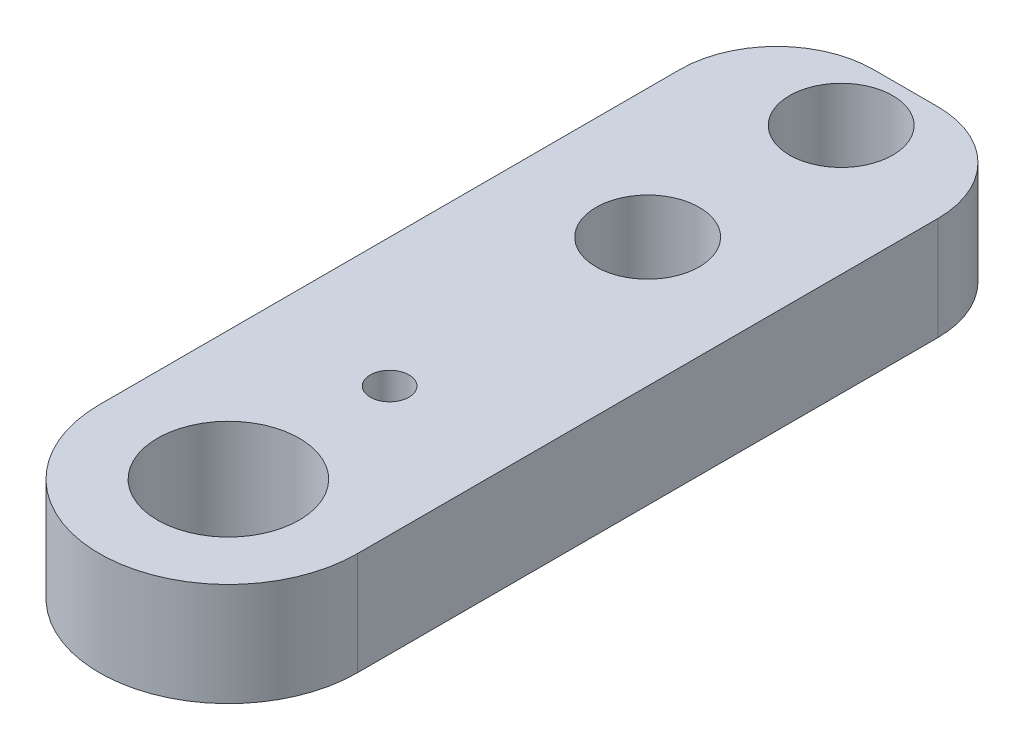
ISO-10303-21;
HEADER;
FILE_DESCRIPTION(('STEP AP214'),'2;1');
FILE_NAME('part.step','',(''),(''),'','','');
FILE_SCHEMA(('AUTOMOTIVE_DESIGN { 1 0 10303 214 1 1 1 1 }'));
ENDSEC;
DATA;
#1=APPLICATION_CONTEXT('core data for automotive mechanical design processes');
#2=APPLICATION_PROTOCOL_DEFINITION('international standard','automotive_design',2000,#1);
#3=PRODUCT_CONTEXT('',#1,'mechanical');
#4=PRODUCT('Part','Part','',(#3));
#5=PRODUCT_RELATED_PRODUCT_CATEGORY('part','',(#4));
#6=PRODUCT_DEFINITION_FORMATION('','',#4);
#7=PRODUCT_DEFINITION_CONTEXT('part definition',#1,'design');
#8=PRODUCT_DEFINITION('design','',#6,#7);
#9=PRODUCT_DEFINITION_SHAPE('','',#8);
#10=(LENGTH_UNIT() NAMED_UNIT(*) SI_UNIT(.MILLI.,.METRE.));
#11=(NAMED_UNIT(*) PLANE_ANGLE_UNIT() SI_UNIT($,.RADIAN.));
#12=(NAMED_UNIT(*) SI_UNIT($,.STERADIAN.) SOLID_ANGLE_UNIT());
#13=UNCERTAINTY_MEASURE_WITH_UNIT(LENGTH_MEASURE(1.E-05),#10,'distance_accuracy_value','');
#14=(GEOMETRIC_REPRESENTATION_CONTEXT(3) GLOBAL_UNCERTAINTY_ASSIGNED_CONTEXT((#13)) GLOBAL_UNIT_ASSIGNED_CONTEXT((#10,
#11,#12)) REPRESENTATION_CONTEXT('',''));
#15=CARTESIAN_POINT('',(0.,0.,0.));
#16=DIRECTION('',(0.,0.,1.));
#17=DIRECTION('',(1.,0.,0.));
#18=AXIS2_PLACEMENT_3D('',#15,#16,#17);
#19=CARTESIAN_POINT('',(1.,3.2,-8.91390148289637));
#20=DIRECTION('',(0.,-1.,0.));
#21=DIRECTION('',(0.,0.,-1.));
#22=AXIS2_PLACEMENT_3D('',#19,#20,#21);
#23=PLANE('',#22);
#24=CARTESIAN_POINT('',(1.,3.2,-8.91390148289637));
#25=DIRECTION('',(0.,1.,0.));
#26=DIRECTION('',(0.,0.,-1.));
#27=AXIS2_PLACEMENT_3D('',#24,#25,#26);
#28=CIRCLE('',#27,3.);
#29=CARTESIAN_POINT('',(4.,3.2,-8.91390148289635));
#30=VERTEX_POINT('',#29);
#31=CARTESIAN_POINT('',(0.999999999999979,3.2,-11.9139014828964));
#32=VERTEX_POINT('',#31);
#33=EDGE_CURVE('E146',#30,#32,#28,.T.);
#34=ORIENTED_EDGE('',*,*,#33,.T.);
#35=DIRECTION('',(-1.,0.,0.));
#36=VECTOR('',#35,1.);
#37=CARTESIAN_POINT('',(-0.999999999999979,3.2,-11.9139014828964));
#38=LINE('',#37,#36);
#39=CARTESIAN_POINT('',(-0.999999999999979,3.2,-11.9139014828964));
#40=VERTEX_POINT('',#39);
#41=EDGE_CURVE('E94',#32,#40,#38,.T.);
#42=ORIENTED_EDGE('',*,*,#41,.T.);
#43=CARTESIAN_POINT('',(-1.,3.2,-8.91390148289637));
#44=DIRECTION('',(0.,1.,0.));
#45=DIRECTION('',(0.,0.,-1.));
#46=AXIS2_PLACEMENT_3D('',#43,#44,#45);
#47=CIRCLE('',#46,3.);
#48=CARTESIAN_POINT('',(-4.,3.2,-8.91390148289634));
#49=VERTEX_POINT('',#48);
#50=EDGE_CURVE('E107',#40,#49,#47,.T.);
#51=ORIENTED_EDGE('',*,*,#50,.T.);
#52=DIRECTION('',(0.,0.,1.));
#53=VECTOR('',#52,1.);
#54=CARTESIAN_POINT('',(-4.,3.2,9.08609851710363));
#55=LINE('',#54,#53);
#56=CARTESIAN_POINT('',(-4.,3.2,9.08609851710363));
#57=VERTEX_POINT('',#56);
#58=EDGE_CURVE('E101',#49,#57,#55,.T.);
#59=ORIENTED_EDGE('',*,*,#58,.T.);
#60=CARTESIAN_POINT('',(0.,3.2,9.08609851710363));
#61=DIRECTION('',(0.,1.,0.));
#62=DIRECTION('',(0.,0.,1.));
#63=AXIS2_PLACEMENT_3D('',#60,#61,#62);
#64=CIRCLE('',#63,4.);
#65=CARTESIAN_POINT('',(4.,3.2,9.08609851710363));
#66=VERTEX_POINT('',#65);
#67=EDGE_CURVE('E105',#57,#66,#64,.T.);
#68=ORIENTED_EDGE('',*,*,#67,.T.);
#69=DIRECTION('',(0.,0.,-1.));
#70=VECTOR('',#69,1.);
#71=CARTESIAN_POINT('',(4.,3.2,-8.91390148289635));
#72=LINE('',#71,#70);
#73=EDGE_CURVE('E57',#66,#30,#72,.T.);
#74=ORIENTED_EDGE('',*,*,#73,.T.);
#75=EDGE_LOOP('',(#34,#42,#51,#59,#68,#74));
#76=FACE_BOUND('',#75,.T.);
#77=CARTESIAN_POINT('',(0.,3.2,-9.91390148289637));
#78=DIRECTION('',(0.,1.,0.));
#79=DIRECTION('',(0.,0.,1.));
#80=AXIS2_PLACEMENT_3D('',#77,#78,#79);
#81=CIRCLE('',#80,1.6);
#82=CARTESIAN_POINT('',(0.,3.2,-8.31390148289637));
#83=VERTEX_POINT('',#82);
#84=EDGE_CURVE('E134',#83,#83,#81,.T.);
#85=ORIENTED_EDGE('',*,*,#84,.F.);
#86=EDGE_LOOP('',(#85));
#87=FACE_BOUND('',#86,.T.);
#88=CARTESIAN_POINT('',(0.,3.2,9.08609851710363));
#89=DIRECTION('',(0.,1.,0.));
#90=DIRECTION('',(0.,0.,1.));
#91=AXIS2_PLACEMENT_3D('',#88,#89,#90);
#92=CIRCLE('',#91,2.2);
#93=CARTESIAN_POINT('',(0.,3.2,11.2860985171036));
#94=VERTEX_POINT('',#93);
#95=EDGE_CURVE('E218',#94,#94,#92,.T.);
#96=ORIENTED_EDGE('',*,*,#95,.F.);
#97=EDGE_LOOP('',(#96));
#98=FACE_BOUND('',#97,.T.);
#99=CARTESIAN_POINT('',(0.,3.2,-3.91390148289637));
#100=DIRECTION('',(0.,1.,0.));
#101=DIRECTION('',(0.,0.,1.));
#102=AXIS2_PLACEMENT_3D('',#99,#100,#101);
#103=CIRCLE('',#102,1.6);
#104=CARTESIAN_POINT('',(0.,3.2,-2.31390148289637));
#105=VERTEX_POINT('',#104);
#106=EDGE_CURVE('E210',#105,#105,#103,.T.);
#107=ORIENTED_EDGE('',*,*,#106,.F.);
#108=EDGE_LOOP('',(#107));
#109=FACE_BOUND('',#108,.T.);
#110=CARTESIAN_POINT('',(0.,3.2,4.08609851710364));
#111=DIRECTION('',(0.,1.,0.));
#112=DIRECTION('',(0.,0.,1.));
#113=AXIS2_PLACEMENT_3D('',#110,#111,#112);
#114=CIRCLE('',#113,0.6);
#115=CARTESIAN_POINT('',(0.,3.2,4.68609851710363));
#116=VERTEX_POINT('',#115);
#117=EDGE_CURVE('E199',#116,#116,#114,.T.);
#118=ORIENTED_EDGE('',*,*,#117,.F.);
#119=EDGE_LOOP('',(#118));
#120=FACE_BOUND('',#119,.T.);
#121=ADVANCED_FACE('F39',(#76,#87,#98,#109,#120),#23,.F.);
#122=CARTESIAN_POINT('',(1.,0.,-8.91390148289637));
#123=DIRECTION('',(0.,-1.,0.));
#124=DIRECTION('',(0.,0.,-1.));
#125=AXIS2_PLACEMENT_3D('',#122,#123,#124);
#126=PLANE('',#125);
#127=CARTESIAN_POINT('',(0.,0.,-3.91390148289637));
#128=DIRECTION('',(0.,1.,0.));
#129=DIRECTION('',(0.,0.,1.));
#130=AXIS2_PLACEMENT_3D('',#127,#128,#129);
#131=CIRCLE('',#130,1.6);
#132=CARTESIAN_POINT('',(0.,0.,-2.31390148289637));
#133=VERTEX_POINT('',#132);
#134=EDGE_CURVE('E207',#133,#133,#131,.T.);
#135=ORIENTED_EDGE('',*,*,#134,.T.);
#136=EDGE_LOOP('',(#135));
#137=FACE_BOUND('',#136,.T.);
#138=CARTESIAN_POINT('',(0.,0.,-9.91390148289637));
#139=DIRECTION('',(0.,1.,0.));
#140=DIRECTION('',(0.,0.,1.));
#141=AXIS2_PLACEMENT_3D('',#138,#139,#140);
#142=CIRCLE('',#141,1.6);
#143=CARTESIAN_POINT('',(0.,0.,-8.31390148289637));
#144=VERTEX_POINT('',#143);
#145=EDGE_CURVE('E222',#144,#144,#142,.T.);
#146=ORIENTED_EDGE('',*,*,#145,.T.);
#147=EDGE_LOOP('',(#146));
#148=FACE_BOUND('',#147,.T.);
#149=CARTESIAN_POINT('',(1.,0.,-8.91390148289637));
#150=DIRECTION('',(0.,1.,0.));
#151=DIRECTION('',(0.,0.,-1.));
#152=AXIS2_PLACEMENT_3D('',#149,#150,#151);
#153=CIRCLE('',#152,3.);
#154=CARTESIAN_POINT('',(4.,0.,-8.91390148289635));
#155=VERTEX_POINT('',#154);
#156=CARTESIAN_POINT('',(0.999999999999979,0.,-11.9139014828964));
#157=VERTEX_POINT('',#156);
#158=EDGE_CURVE('E129',#155,#157,#153,.T.);
#159=ORIENTED_EDGE('',*,*,#158,.F.);
#160=DIRECTION('',(0.,0.,-1.));
#161=VECTOR('',#160,1.);
#162=CARTESIAN_POINT('',(4.,0.,-8.91390148289635));
#163=LINE('',#162,#161);
#164=CARTESIAN_POINT('',(4.,0.,9.08609851710363));
#165=VERTEX_POINT('',#164);
#166=EDGE_CURVE('E86',#165,#155,#163,.T.);
#167=ORIENTED_EDGE('',*,*,#166,.F.);
#168=CARTESIAN_POINT('',(0.,0.,9.08609851710363));
#169=DIRECTION('',(0.,1.,0.));
#170=DIRECTION('',(0.,0.,1.));
#171=AXIS2_PLACEMENT_3D('',#168,#169,#170);
#172=CIRCLE('',#171,4.);
#173=CARTESIAN_POINT('',(-4.,0.,9.08609851710363));
#174=VERTEX_POINT('',#173);
#175=EDGE_CURVE('E80',#174,#165,#172,.T.);
#176=ORIENTED_EDGE('',*,*,#175,.F.);
#177=DIRECTION('',(0.,0.,1.));
#178=VECTOR('',#177,1.);
#179=CARTESIAN_POINT('',(-4.,0.,9.08609851710363));
#180=LINE('',#179,#178);
#181=CARTESIAN_POINT('',(-4.,0.,-8.91390148289634));
#182=VERTEX_POINT('',#181);
#183=EDGE_CURVE('E116',#182,#174,#180,.T.);
#184=ORIENTED_EDGE('',*,*,#183,.F.);
#185=CARTESIAN_POINT('',(-1.,0.,-8.91390148289637));
#186=DIRECTION('',(0.,1.,0.));
#187=DIRECTION('',(0.,0.,-1.));
#188=AXIS2_PLACEMENT_3D('',#185,#186,#187);
#189=CIRCLE('',#188,3.);
#190=CARTESIAN_POINT('',(-0.999999999999979,0.,-11.9139014828964));
#191=VERTEX_POINT('',#190);
#192=EDGE_CURVE('E137',#191,#182,#189,.T.);
#193=ORIENTED_EDGE('',*,*,#192,.F.);
#194=DIRECTION('',(-1.,0.,0.));
#195=VECTOR('',#194,1.);
#196=CARTESIAN_POINT('',(-0.999999999999979,0.,-11.9139014828964));
#197=LINE('',#196,#195);
#198=EDGE_CURVE('E133',#157,#191,#197,.T.);
#199=ORIENTED_EDGE('',*,*,#198,.F.);
#200=EDGE_LOOP('',(#159,#167,#176,#184,#193,#199));
#201=FACE_BOUND('',#200,.T.);
#202=CARTESIAN_POINT('',(0.,0.,9.08609851710363));
#203=DIRECTION('',(0.,1.,0.));
#204=DIRECTION('',(0.,0.,1.));
#205=AXIS2_PLACEMENT_3D('',#202,#203,#204);
#206=CIRCLE('',#205,2.2);
#207=CARTESIAN_POINT('',(0.,0.,11.2860985171036));
#208=VERTEX_POINT('',#207);
#209=EDGE_CURVE('E214',#208,#208,#206,.T.);
#210=ORIENTED_EDGE('',*,*,#209,.T.);
#211=EDGE_LOOP('',(#210));
#212=FACE_BOUND('',#211,.T.);
#213=CARTESIAN_POINT('',(0.,0.,4.08609851710364));
#214=DIRECTION('',(0.,1.,0.));
#215=DIRECTION('',(0.,0.,1.));
#216=AXIS2_PLACEMENT_3D('',#213,#214,#215);
#217=CIRCLE('',#216,0.6);
#218=CARTESIAN_POINT('',(0.,0.,4.68609851710363));
#219=VERTEX_POINT('',#218);
#220=EDGE_CURVE('E202',#219,#219,#217,.T.);
#221=ORIENTED_EDGE('',*,*,#220,.T.);
#222=EDGE_LOOP('',(#221));
#223=FACE_BOUND('',#222,.T.);
#224=ADVANCED_FACE('F159',(#137,#148,#201,#212,#223),#126,.T.);
#225=CARTESIAN_POINT('',(1.,3.2,-8.91390148289637));
#226=DIRECTION('',(0.,-1.,0.));
#227=DIRECTION('',(0.,0.,-1.));
#228=AXIS2_PLACEMENT_3D('',#225,#226,#227);
#229=CYLINDRICAL_SURFACE('',#228,3.);
#230=ORIENTED_EDGE('',*,*,#158,.T.);
#231=DIRECTION('',(0.,-1.,0.));
#232=VECTOR('',#231,1.);
#233=CARTESIAN_POINT('',(0.999999999999979,3.2,-11.9139014828964));
#234=LINE('',#233,#232);
#235=EDGE_CURVE('E11',#32,#157,#234,.T.);
#236=ORIENTED_EDGE('',*,*,#235,.F.);
#237=ORIENTED_EDGE('',*,*,#33,.F.);
#238=DIRECTION('',(0.,-1.,0.));
#239=VECTOR('',#238,1.);
#240=CARTESIAN_POINT('',(4.,3.2,-8.91390148289635));
#241=LINE('',#240,#239);
#242=EDGE_CURVE('E125',#30,#155,#241,.T.);
#243=ORIENTED_EDGE('',*,*,#242,.T.);
#244=EDGE_LOOP('',(#230,#236,#237,#243));
#245=FACE_BOUND('',#244,.T.);
#246=ADVANCED_FACE('F41',(#245),#229,.T.);
#247=CARTESIAN_POINT('',(-0.999999999999979,3.2,-11.9139014828964));
#248=DIRECTION('',(0.,0.,1.));
#249=DIRECTION('',(1.,0.,0.));
#250=AXIS2_PLACEMENT_3D('',#247,#248,#249);
#251=PLANE('',#250);
#252=ORIENTED_EDGE('',*,*,#198,.T.);
#253=DIRECTION('',(0.,-1.,0.));
#254=VECTOR('',#253,1.);
#255=CARTESIAN_POINT('',(-0.999999999999979,3.2,-11.9139014828964));
#256=LINE('',#255,#254);
#257=EDGE_CURVE('E49',#40,#191,#256,.T.);
#258=ORIENTED_EDGE('',*,*,#257,.F.);
#259=ORIENTED_EDGE('',*,*,#41,.F.);
#260=ORIENTED_EDGE('',*,*,#235,.T.);
#261=EDGE_LOOP('',(#252,#258,#259,#260));
#262=FACE_BOUND('',#261,.T.);
#263=ADVANCED_FACE('F288',(#262),#251,.F.);
#264=CARTESIAN_POINT('',(-1.,3.2,-8.91390148289637));
#265=DIRECTION('',(0.,-1.,0.));
#266=DIRECTION('',(0.,0.,-1.));
#267=AXIS2_PLACEMENT_3D('',#264,#265,#266);
#268=CYLINDRICAL_SURFACE('',#267,3.);
#269=ORIENTED_EDGE('',*,*,#192,.T.);
#270=DIRECTION('',(0.,-1.,0.));
#271=VECTOR('',#270,1.);
#272=CARTESIAN_POINT('',(-4.,3.2,-8.91390148289634));
#273=LINE('',#272,#271);
#274=EDGE_CURVE('E118',#49,#182,#273,.T.);
#275=ORIENTED_EDGE('',*,*,#274,.F.);
#276=ORIENTED_EDGE('',*,*,#50,.F.);
#277=ORIENTED_EDGE('',*,*,#257,.T.);
#278=EDGE_LOOP('',(#269,#275,#276,#277));
#279=FACE_BOUND('',#278,.T.);
#280=ADVANCED_FACE('F156',(#279),#268,.T.);
#281=CARTESIAN_POINT('',(-4.,3.2,9.08609851710363));
#282=DIRECTION('',(1.,0.,0.));
#283=DIRECTION('',(0.,0.,-1.));
#284=AXIS2_PLACEMENT_3D('',#281,#282,#283);
#285=PLANE('',#284);
#286=ORIENTED_EDGE('',*,*,#183,.T.);
#287=DIRECTION('',(0.,-1.,0.));
#288=VECTOR('',#287,1.);
#289=CARTESIAN_POINT('',(-4.,3.2,9.08609851710363));
#290=LINE('',#289,#288);
#291=EDGE_CURVE('E113',#57,#174,#290,.T.);
#292=ORIENTED_EDGE('',*,*,#291,.F.);
#293=ORIENTED_EDGE('',*,*,#58,.F.);
#294=ORIENTED_EDGE('',*,*,#274,.T.);
#295=EDGE_LOOP('',(#286,#292,#293,#294));
#296=FACE_BOUND('',#295,.T.);
#297=ADVANCED_FACE('F114',(#296),#285,.F.);
#298=CARTESIAN_POINT('',(0.,3.2,9.08609851710363));
#299=DIRECTION('',(0.,-1.,0.));
#300=DIRECTION('',(0.,0.,-1.));
#301=AXIS2_PLACEMENT_3D('',#298,#299,#300);
#302=CYLINDRICAL_SURFACE('',#301,4.);
#303=ORIENTED_EDGE('',*,*,#175,.T.);
#304=DIRECTION('',(0.,-1.,0.));
#305=VECTOR('',#304,1.);
#306=CARTESIAN_POINT('',(4.,3.2,9.08609851710363));
#307=LINE('',#306,#305);
#308=EDGE_CURVE('E119',#66,#165,#307,.T.);
#309=ORIENTED_EDGE('',*,*,#308,.F.);
#310=ORIENTED_EDGE('',*,*,#67,.F.);
#311=ORIENTED_EDGE('',*,*,#291,.T.);
#312=EDGE_LOOP('',(#303,#309,#310,#311));
#313=FACE_BOUND('',#312,.T.);
#314=ADVANCED_FACE('F121',(#313),#302,.T.);
#315=CARTESIAN_POINT('',(4.,3.2,-8.91390148289635));
#316=DIRECTION('',(-1.,0.,0.));
#317=DIRECTION('',(0.,0.,1.));
#318=AXIS2_PLACEMENT_3D('',#315,#316,#317);
#319=PLANE('',#318);
#320=ORIENTED_EDGE('',*,*,#166,.T.);
#321=ORIENTED_EDGE('',*,*,#242,.F.);
#322=ORIENTED_EDGE('',*,*,#73,.F.);
#323=ORIENTED_EDGE('',*,*,#308,.T.);
#324=EDGE_LOOP('',(#320,#321,#322,#323));
#325=FACE_BOUND('',#324,.T.);
#326=ADVANCED_FACE('F164',(#325),#319,.F.);
#327=CARTESIAN_POINT('',(0.,3.2,-9.91390148289637));
#328=DIRECTION('',(0.,-1.,0.));
#329=DIRECTION('',(0.,0.,-1.));
#330=AXIS2_PLACEMENT_3D('',#327,#328,#329);
#331=CYLINDRICAL_SURFACE('',#330,1.6);
#332=ORIENTED_EDGE('',*,*,#84,.T.);
#333=EDGE_LOOP('',(#332));
#334=FACE_BOUND('',#333,.T.);
#335=ORIENTED_EDGE('',*,*,#145,.F.);
#336=EDGE_LOOP('',(#335));
#337=FACE_BOUND('',#336,.T.);
#338=ADVANCED_FACE('F166',(#334,#337),#331,.F.);
#339=CARTESIAN_POINT('',(0.,3.2,9.08609851710363));
#340=DIRECTION('',(0.,-1.,0.));
#341=DIRECTION('',(0.,0.,-1.));
#342=AXIS2_PLACEMENT_3D('',#339,#340,#341);
#343=CYLINDRICAL_SURFACE('',#342,2.2);
#344=ORIENTED_EDGE('',*,*,#95,.T.);
#345=EDGE_LOOP('',(#344));
#346=FACE_BOUND('',#345,.T.);
#347=ORIENTED_EDGE('',*,*,#209,.F.);
#348=EDGE_LOOP('',(#347));
#349=FACE_BOUND('',#348,.T.);
#350=ADVANCED_FACE('F172',(#346,#349),#343,.F.);
#351=CARTESIAN_POINT('',(0.,3.2,-3.91390148289637));
#352=DIRECTION('',(0.,-1.,0.));
#353=DIRECTION('',(0.,0.,-1.));
#354=AXIS2_PLACEMENT_3D('',#351,#352,#353);
#355=CYLINDRICAL_SURFACE('',#354,1.6);
#356=ORIENTED_EDGE('',*,*,#106,.T.);
#357=EDGE_LOOP('',(#356));
#358=FACE_BOUND('',#357,.T.);
#359=ORIENTED_EDGE('',*,*,#134,.F.);
#360=EDGE_LOOP('',(#359));
#361=FACE_BOUND('',#360,.T.);
#362=ADVANCED_FACE('F186',(#358,#361),#355,.F.);
#363=CARTESIAN_POINT('',(0.,3.2,4.08609851710364));
#364=DIRECTION('',(0.,-1.,0.));
#365=DIRECTION('',(0.,0.,-1.));
#366=AXIS2_PLACEMENT_3D('',#363,#364,#365);
#367=CYLINDRICAL_SURFACE('',#366,0.6);
#368=ORIENTED_EDGE('',*,*,#117,.T.);
#369=EDGE_LOOP('',(#368));
#370=FACE_BOUND('',#369,.T.);
#371=ORIENTED_EDGE('',*,*,#220,.F.);
#372=EDGE_LOOP('',(#371));
#373=FACE_BOUND('',#372,.T.);
#374=ADVANCED_FACE('F190',(#370,#373),#367,.F.);
#375=CLOSED_SHELL('',(#121,#224,#246,#263,#280,#297,#314,#326,#338,#350,#362,#374));
#376=MANIFOLD_SOLID_BREP('B2',#375);
#377=ADVANCED_BREP_SHAPE_REPRESENTATION('',(#18,#376),#14);
#378=SHAPE_DEFINITION_REPRESENTATION(#9,#377);
ENDSEC;
END-ISO-10303-21;
